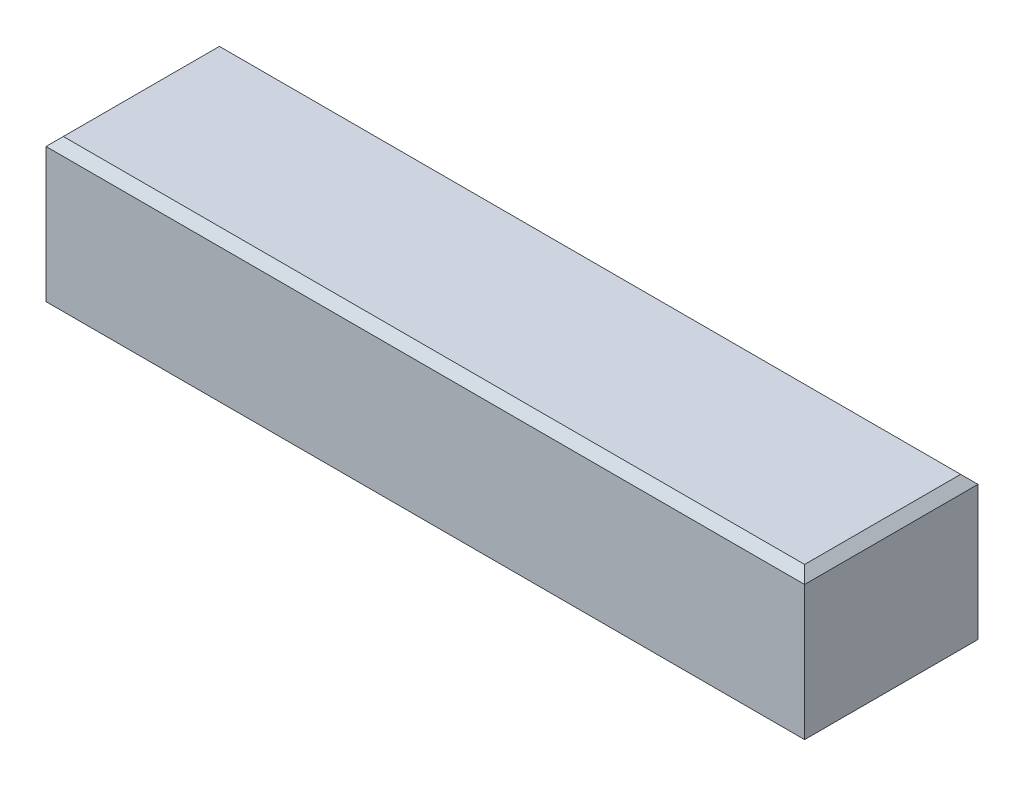
ISO-10303-21;
HEADER;
FILE_DESCRIPTION(('STEP AP214'),'2;1');
FILE_NAME('part.step','',(''),(''),'','','');
FILE_SCHEMA(('AUTOMOTIVE_DESIGN { 1 0 10303 214 1 1 1 1 }'));
ENDSEC;
DATA;
#1=APPLICATION_CONTEXT('core data for automotive mechanical design processes');
#2=APPLICATION_PROTOCOL_DEFINITION('international standard','automotive_design',2000,#1);
#3=PRODUCT_CONTEXT('',#1,'mechanical');
#4=PRODUCT('Part','Part','',(#3));
#5=PRODUCT_RELATED_PRODUCT_CATEGORY('part','',(#4));
#6=PRODUCT_DEFINITION_FORMATION('','',#4);
#7=PRODUCT_DEFINITION_CONTEXT('part definition',#1,'design');
#8=PRODUCT_DEFINITION('design','',#6,#7);
#9=PRODUCT_DEFINITION_SHAPE('','',#8);
#10=(LENGTH_UNIT() NAMED_UNIT(*) SI_UNIT(.MILLI.,.METRE.));
#11=(NAMED_UNIT(*) PLANE_ANGLE_UNIT() SI_UNIT($,.RADIAN.));
#12=(NAMED_UNIT(*) SI_UNIT($,.STERADIAN.) SOLID_ANGLE_UNIT());
#13=UNCERTAINTY_MEASURE_WITH_UNIT(LENGTH_MEASURE(1.E-05),#10,'distance_accuracy_value','');
#14=(GEOMETRIC_REPRESENTATION_CONTEXT(3) GLOBAL_UNCERTAINTY_ASSIGNED_CONTEXT((#13)) GLOBAL_UNIT_ASSIGNED_CONTEXT((#10,
#11,#12)) REPRESENTATION_CONTEXT('',''));
#15=CARTESIAN_POINT('',(0.,0.,0.));
#16=DIRECTION('',(0.,0.,1.));
#17=DIRECTION('',(1.,0.,0.));
#18=AXIS2_PLACEMENT_3D('',#15,#16,#17);
#19=CARTESIAN_POINT('',(0.,3.5,0.));
#20=DIRECTION('',(1.,0.,0.));
#21=DIRECTION('',(0.,0.,-1.));
#22=AXIS2_PLACEMENT_3D('',#19,#20,#21);
#23=PLANE('',#22);
#24=DIRECTION('',(0.,0.,-1.));
#25=VECTOR('',#24,1.);
#26=CARTESIAN_POINT('',(0.,6.6,2.));
#27=LINE('',#26,#25);
#28=CARTESIAN_POINT('',(0.,6.6,4.));
#29=VERTEX_POINT('',#28);
#30=CARTESIAN_POINT('',(0.,6.6,-4.));
#31=VERTEX_POINT('',#30);
#32=EDGE_CURVE('E96',#29,#31,#27,.T.);
#33=ORIENTED_EDGE('',*,*,#32,.T.);
#34=DIRECTION('',(0.,1.,0.));
#35=VECTOR('',#34,1.);
#36=CARTESIAN_POINT('',(0.,0.4,-4.));
#37=LINE('',#36,#35);
#38=CARTESIAN_POINT('',(0.,0.4,-4.));
#39=VERTEX_POINT('',#38);
#40=EDGE_CURVE('E11',#39,#31,#37,.T.);
#41=ORIENTED_EDGE('',*,*,#40,.F.);
#42=DIRECTION('',(0.,0.,1.));
#43=VECTOR('',#42,1.);
#44=CARTESIAN_POINT('',(0.,0.4,2.));
#45=LINE('',#44,#43);
#46=CARTESIAN_POINT('',(0.,0.4,4.));
#47=VERTEX_POINT('',#46);
#48=EDGE_CURVE('E120',#39,#47,#45,.T.);
#49=ORIENTED_EDGE('',*,*,#48,.T.);
#50=DIRECTION('',(0.,-1.,0.));
#51=VECTOR('',#50,1.);
#52=CARTESIAN_POINT('',(0.,6.6,4.));
#53=LINE('',#52,#51);
#54=EDGE_CURVE('E26',#29,#47,#53,.T.);
#55=ORIENTED_EDGE('',*,*,#54,.F.);
#56=EDGE_LOOP('',(#33,#41,#49,#55));
#57=FACE_BOUND('',#56,.T.);
#58=ADVANCED_FACE('F16',(#57),#23,.F.);
#59=CARTESIAN_POINT('',(0.,3.5,-4.));
#60=DIRECTION('',(0.,0.,-1.));
#61=DIRECTION('',(0.,1.,0.));
#62=AXIS2_PLACEMENT_3D('',#59,#60,#61);
#63=PLANE('',#62);
#64=DIRECTION('',(0.,-1.,0.));
#65=VECTOR('',#64,1.);
#66=CARTESIAN_POINT('',(35.,0.4,-4.));
#67=LINE('',#66,#65);
#68=CARTESIAN_POINT('',(35.,6.6,-4.));
#69=VERTEX_POINT('',#68);
#70=CARTESIAN_POINT('',(35.,0.4,-4.));
#71=VERTEX_POINT('',#70);
#72=EDGE_CURVE('E129',#69,#71,#67,.T.);
#73=ORIENTED_EDGE('',*,*,#72,.T.);
#74=DIRECTION('',(1.,0.,0.));
#75=VECTOR('',#74,1.);
#76=CARTESIAN_POINT('',(0.,0.4,-4.));
#77=LINE('',#76,#75);
#78=EDGE_CURVE('E78',#39,#71,#77,.T.);
#79=ORIENTED_EDGE('',*,*,#78,.F.);
#80=ORIENTED_EDGE('',*,*,#40,.T.);
#81=DIRECTION('',(1.,0.,0.));
#82=VECTOR('',#81,1.);
#83=CARTESIAN_POINT('',(0.,6.6,-4.));
#84=LINE('',#83,#82);
#85=EDGE_CURVE('E76',#31,#69,#84,.T.);
#86=ORIENTED_EDGE('',*,*,#85,.T.);
#87=EDGE_LOOP('',(#73,#79,#80,#86));
#88=FACE_BOUND('',#87,.T.);
#89=ADVANCED_FACE('F18',(#88),#63,.T.);
#90=CARTESIAN_POINT('',(0.,6.8,3.8));
#91=DIRECTION('',(0.,0.707106781186547,0.707106781186548));
#92=DIRECTION('',(0.,-0.707106781186548,0.707106781186547));
#93=AXIS2_PLACEMENT_3D('',#90,#91,#92);
#94=PLANE('',#93);
#95=DIRECTION('',(-0.577350269189626,-0.577350269189626,0.577350269189626));
#96=VECTOR('',#95,1.);
#97=CARTESIAN_POINT('',(0.133333333333333,6.73333333333333,3.86666666666666));
#98=LINE('',#97,#96);
#99=CARTESIAN_POINT('',(0.4,7.,3.6));
#100=VERTEX_POINT('',#99);
#101=EDGE_CURVE('E101',#100,#29,#98,.T.);
#102=ORIENTED_EDGE('',*,*,#101,.T.);
#103=DIRECTION('',(1.,0.,0.));
#104=VECTOR('',#103,1.);
#105=CARTESIAN_POINT('',(0.,6.6,4.));
#106=LINE('',#105,#104);
#107=CARTESIAN_POINT('',(35.,6.6,4.));
#108=VERTEX_POINT('',#107);
#109=EDGE_CURVE('E150',#29,#108,#106,.T.);
#110=ORIENTED_EDGE('',*,*,#109,.T.);
#111=DIRECTION('',(-0.577350269189623,0.577350269189627,-0.577350269189627));
#112=VECTOR('',#111,1.);
#113=CARTESIAN_POINT('',(29.0333333333334,12.5666666666667,-1.96666666666665));
#114=LINE('',#113,#112);
#115=CARTESIAN_POINT('',(34.6,7.,3.6));
#116=VERTEX_POINT('',#115);
#117=EDGE_CURVE('E109',#108,#116,#114,.T.);
#118=ORIENTED_EDGE('',*,*,#117,.T.);
#119=DIRECTION('',(1.,0.,0.));
#120=VECTOR('',#119,1.);
#121=CARTESIAN_POINT('',(0.,7.,3.6));
#122=LINE('',#121,#120);
#123=EDGE_CURVE('E90',#100,#116,#122,.T.);
#124=ORIENTED_EDGE('',*,*,#123,.F.);
#125=EDGE_LOOP('',(#102,#110,#118,#124));
#126=FACE_BOUND('',#125,.T.);
#127=ADVANCED_FACE('F181',(#126),#94,.T.);
#128=CARTESIAN_POINT('',(0.,3.5,4.));
#129=DIRECTION('',(0.,0.,1.));
#130=DIRECTION('',(0.,-1.,0.));
#131=AXIS2_PLACEMENT_3D('',#128,#129,#130);
#132=PLANE('',#131);
#133=DIRECTION('',(0.,1.,0.));
#134=VECTOR('',#133,1.);
#135=CARTESIAN_POINT('',(35.,6.6,4.));
#136=LINE('',#135,#134);
#137=CARTESIAN_POINT('',(35.,0.4,4.));
#138=VERTEX_POINT('',#137);
#139=EDGE_CURVE('E114',#138,#108,#136,.T.);
#140=ORIENTED_EDGE('',*,*,#139,.T.);
#141=ORIENTED_EDGE('',*,*,#109,.F.);
#142=ORIENTED_EDGE('',*,*,#54,.T.);
#143=DIRECTION('',(1.,0.,0.));
#144=VECTOR('',#143,1.);
#145=CARTESIAN_POINT('',(0.,0.4,4.));
#146=LINE('',#145,#144);
#147=EDGE_CURVE('E148',#47,#138,#146,.T.);
#148=ORIENTED_EDGE('',*,*,#147,.T.);
#149=EDGE_LOOP('',(#140,#141,#142,#148));
#150=FACE_BOUND('',#149,.T.);
#151=ADVANCED_FACE('F206',(#150),#132,.T.);
#152=CARTESIAN_POINT('',(0.,0.2,3.8));
#153=DIRECTION('',(0.,-0.707106781186548,0.707106781186548));
#154=DIRECTION('',(0.,-0.707106781186548,-0.707106781186548));
#155=AXIS2_PLACEMENT_3D('',#152,#153,#154);
#156=PLANE('',#155);
#157=DIRECTION('',(0.577350269189623,0.577350269189627,0.577350269189627));
#158=VECTOR('',#157,1.);
#159=CARTESIAN_POINT('',(29.0333333333334,-5.56666666666665,-1.96666666666665));
#160=LINE('',#159,#158);
#161=CARTESIAN_POINT('',(34.6,0.,3.6));
#162=VERTEX_POINT('',#161);
#163=EDGE_CURVE('E126',#162,#138,#160,.T.);
#164=ORIENTED_EDGE('',*,*,#163,.T.);
#165=ORIENTED_EDGE('',*,*,#147,.F.);
#166=DIRECTION('',(0.577350269189626,-0.577350269189626,-0.577350269189626));
#167=VECTOR('',#166,1.);
#168=CARTESIAN_POINT('',(0.133333333333333,0.266666666666666,3.86666666666666));
#169=LINE('',#168,#167);
#170=CARTESIAN_POINT('',(0.4,0.,3.6));
#171=VERTEX_POINT('',#170);
#172=EDGE_CURVE('E122',#47,#171,#169,.T.);
#173=ORIENTED_EDGE('',*,*,#172,.T.);
#174=DIRECTION('',(1.,0.,0.));
#175=VECTOR('',#174,1.);
#176=CARTESIAN_POINT('',(0.,0.,3.6));
#177=LINE('',#176,#175);
#178=EDGE_CURVE('E124',#171,#162,#177,.T.);
#179=ORIENTED_EDGE('',*,*,#178,.T.);
#180=EDGE_LOOP('',(#164,#165,#173,#179));
#181=FACE_BOUND('',#180,.T.);
#182=ADVANCED_FACE('F158',(#181),#156,.T.);
#183=CARTESIAN_POINT('',(0.2,0.2,4.));
#184=DIRECTION('',(0.707106781186548,0.707106781186548,0.));
#185=DIRECTION('',(0.707106781186548,-0.707106781186548,0.));
#186=AXIS2_PLACEMENT_3D('',#183,#184,#185);
#187=PLANE('',#186);
#188=ORIENTED_EDGE('',*,*,#48,.F.);
#189=DIRECTION('',(-0.577350269189626,0.577350269189626,-0.577350269189626));
#190=VECTOR('',#189,1.);
#191=CARTESIAN_POINT('',(1.46666666666667,-1.06666666666667,-2.53333333333333));
#192=LINE('',#191,#190);
#193=CARTESIAN_POINT('',(0.4,0.,-3.6));
#194=VERTEX_POINT('',#193);
#195=EDGE_CURVE('E131',#194,#39,#192,.T.);
#196=ORIENTED_EDGE('',*,*,#195,.F.);
#197=DIRECTION('',(0.,0.,-1.));
#198=VECTOR('',#197,1.);
#199=CARTESIAN_POINT('',(0.4,0.,2.));
#200=LINE('',#199,#198);
#201=EDGE_CURVE('E123',#171,#194,#200,.T.);
#202=ORIENTED_EDGE('',*,*,#201,.F.);
#203=ORIENTED_EDGE('',*,*,#172,.F.);
#204=EDGE_LOOP('',(#188,#196,#202,#203));
#205=FACE_BOUND('',#204,.T.);
#206=ADVANCED_FACE('F161',(#205),#187,.F.);
#207=CARTESIAN_POINT('',(0.,0.,0.));
#208=DIRECTION('',(0.,-1.,0.));
#209=DIRECTION('',(0.,0.,-1.));
#210=AXIS2_PLACEMENT_3D('',#207,#208,#209);
#211=PLANE('',#210);
#212=DIRECTION('',(0.,0.,1.));
#213=VECTOR('',#212,1.);
#214=CARTESIAN_POINT('',(34.6,0.,2.));
#215=LINE('',#214,#213);
#216=CARTESIAN_POINT('',(34.6,0.,-3.6));
#217=VERTEX_POINT('',#216);
#218=EDGE_CURVE('E128',#217,#162,#215,.T.);
#219=ORIENTED_EDGE('',*,*,#218,.T.);
#220=ORIENTED_EDGE('',*,*,#178,.F.);
#221=ORIENTED_EDGE('',*,*,#201,.T.);
#222=DIRECTION('',(1.,0.,0.));
#223=VECTOR('',#222,1.);
#224=CARTESIAN_POINT('',(0.,0.,-3.6));
#225=LINE('',#224,#223);
#226=EDGE_CURVE('E130',#194,#217,#225,.T.);
#227=ORIENTED_EDGE('',*,*,#226,.T.);
#228=EDGE_LOOP('',(#219,#220,#221,#227));
#229=FACE_BOUND('',#228,.T.);
#230=ADVANCED_FACE('F162',(#229),#211,.T.);
#231=CARTESIAN_POINT('',(0.,0.2,-3.8));
#232=DIRECTION('',(0.,-0.707106781186548,-0.707106781186547));
#233=DIRECTION('',(0.,0.707106781186547,-0.707106781186548));
#234=AXIS2_PLACEMENT_3D('',#231,#232,#233);
#235=PLANE('',#234);
#236=DIRECTION('',(-0.577350269189623,-0.577350269189627,0.577350269189627));
#237=VECTOR('',#236,1.);
#238=CARTESIAN_POINT('',(27.7,-6.9,3.3));
#239=LINE('',#238,#237);
#240=EDGE_CURVE('E20',#71,#217,#239,.T.);
#241=ORIENTED_EDGE('',*,*,#240,.T.);
#242=ORIENTED_EDGE('',*,*,#226,.F.);
#243=ORIENTED_EDGE('',*,*,#195,.T.);
#244=ORIENTED_EDGE('',*,*,#78,.T.);
#245=EDGE_LOOP('',(#241,#242,#243,#244));
#246=FACE_BOUND('',#245,.T.);
#247=ADVANCED_FACE('F164',(#246),#235,.T.);
#248=CARTESIAN_POINT('',(34.8,0.2,4.));
#249=DIRECTION('',(-0.70710678118655,0.707106781186545,0.));
#250=DIRECTION('',(0.707106781186545,0.70710678118655,0.));
#251=AXIS2_PLACEMENT_3D('',#248,#249,#250);
#252=PLANE('',#251);
#253=DIRECTION('',(0.,0.,-1.));
#254=VECTOR('',#253,1.);
#255=CARTESIAN_POINT('',(35.,0.400000000000005,2.));
#256=LINE('',#255,#254);
#257=EDGE_CURVE('E117',#138,#71,#256,.T.);
#258=ORIENTED_EDGE('',*,*,#257,.F.);
#259=ORIENTED_EDGE('',*,*,#163,.F.);
#260=ORIENTED_EDGE('',*,*,#218,.F.);
#261=ORIENTED_EDGE('',*,*,#240,.F.);
#262=EDGE_LOOP('',(#258,#259,#260,#261));
#263=FACE_BOUND('',#262,.T.);
#264=ADVANCED_FACE('F171',(#263),#252,.F.);
#265=CARTESIAN_POINT('',(35.,3.5,0.));
#266=DIRECTION('',(1.,0.,0.));
#267=DIRECTION('',(0.,0.,-1.));
#268=AXIS2_PLACEMENT_3D('',#265,#266,#267);
#269=PLANE('',#268);
#270=DIRECTION('',(0.,0.,1.));
#271=VECTOR('',#270,1.);
#272=CARTESIAN_POINT('',(35.,6.6,2.));
#273=LINE('',#272,#271);
#274=EDGE_CURVE('E111',#69,#108,#273,.T.);
#275=ORIENTED_EDGE('',*,*,#274,.T.);
#276=ORIENTED_EDGE('',*,*,#139,.F.);
#277=ORIENTED_EDGE('',*,*,#257,.T.);
#278=ORIENTED_EDGE('',*,*,#72,.F.);
#279=EDGE_LOOP('',(#275,#276,#277,#278));
#280=FACE_BOUND('',#279,.T.);
#281=ADVANCED_FACE('F191',(#280),#269,.T.);
#282=CARTESIAN_POINT('',(34.8,6.8,4.));
#283=DIRECTION('',(-0.70710678118655,-0.707106781186545,0.));
#284=DIRECTION('',(-0.707106781186545,0.70710678118655,0.));
#285=AXIS2_PLACEMENT_3D('',#282,#283,#284);
#286=PLANE('',#285);
#287=ORIENTED_EDGE('',*,*,#117,.F.);
#288=ORIENTED_EDGE('',*,*,#274,.F.);
#289=DIRECTION('',(0.577350269189623,-0.577350269189627,-0.577350269189627));
#290=VECTOR('',#289,1.);
#291=CARTESIAN_POINT('',(27.7,13.9,3.3));
#292=LINE('',#291,#290);
#293=CARTESIAN_POINT('',(34.6,7.,-3.6));
#294=VERTEX_POINT('',#293);
#295=EDGE_CURVE('E89',#294,#69,#292,.T.);
#296=ORIENTED_EDGE('',*,*,#295,.F.);
#297=DIRECTION('',(0.,0.,-1.));
#298=VECTOR('',#297,1.);
#299=CARTESIAN_POINT('',(34.6,7.,2.));
#300=LINE('',#299,#298);
#301=EDGE_CURVE('E112',#116,#294,#300,.T.);
#302=ORIENTED_EDGE('',*,*,#301,.F.);
#303=EDGE_LOOP('',(#287,#288,#296,#302));
#304=FACE_BOUND('',#303,.T.);
#305=ADVANCED_FACE('F185',(#304),#286,.F.);
#306=CARTESIAN_POINT('',(0.,7.,0.));
#307=DIRECTION('',(0.,1.,0.));
#308=DIRECTION('',(0.,0.,1.));
#309=AXIS2_PLACEMENT_3D('',#306,#307,#308);
#310=PLANE('',#309);
#311=DIRECTION('',(0.,0.,1.));
#312=VECTOR('',#311,1.);
#313=CARTESIAN_POINT('',(0.4,7.,2.));
#314=LINE('',#313,#312);
#315=CARTESIAN_POINT('',(0.4,7.,-3.6));
#316=VERTEX_POINT('',#315);
#317=EDGE_CURVE('E98',#316,#100,#314,.T.);
#318=ORIENTED_EDGE('',*,*,#317,.T.);
#319=ORIENTED_EDGE('',*,*,#123,.T.);
#320=ORIENTED_EDGE('',*,*,#301,.T.);
#321=DIRECTION('',(1.,0.,0.));
#322=VECTOR('',#321,1.);
#323=CARTESIAN_POINT('',(0.,7.,-3.6));
#324=LINE('',#323,#322);
#325=EDGE_CURVE('E99',#316,#294,#324,.T.);
#326=ORIENTED_EDGE('',*,*,#325,.F.);
#327=EDGE_LOOP('',(#318,#319,#320,#326));
#328=FACE_BOUND('',#327,.T.);
#329=ADVANCED_FACE('F183',(#328),#310,.T.);
#330=CARTESIAN_POINT('',(0.,6.8,-3.8));
#331=DIRECTION('',(0.,0.707106781186548,-0.707106781186548));
#332=DIRECTION('',(0.,0.707106781186548,0.707106781186548));
#333=AXIS2_PLACEMENT_3D('',#330,#331,#332);
#334=PLANE('',#333);
#335=DIRECTION('',(0.577350269189626,0.577350269189626,0.577350269189626));
#336=VECTOR('',#335,1.);
#337=CARTESIAN_POINT('',(1.46666666666667,8.06666666666667,-2.53333333333333));
#338=LINE('',#337,#336);
#339=EDGE_CURVE('E86',#31,#316,#338,.T.);
#340=ORIENTED_EDGE('',*,*,#339,.T.);
#341=ORIENTED_EDGE('',*,*,#325,.T.);
#342=ORIENTED_EDGE('',*,*,#295,.T.);
#343=ORIENTED_EDGE('',*,*,#85,.F.);
#344=EDGE_LOOP('',(#340,#341,#342,#343));
#345=FACE_BOUND('',#344,.T.);
#346=ADVANCED_FACE('F84',(#345),#334,.T.);
#347=CARTESIAN_POINT('',(0.2,6.8,4.));
#348=DIRECTION('',(0.707106781186548,-0.707106781186547,0.));
#349=DIRECTION('',(-0.707106781186547,-0.707106781186548,0.));
#350=AXIS2_PLACEMENT_3D('',#347,#348,#349);
#351=PLANE('',#350);
#352=ORIENTED_EDGE('',*,*,#32,.F.);
#353=ORIENTED_EDGE('',*,*,#101,.F.);
#354=ORIENTED_EDGE('',*,*,#317,.F.);
#355=ORIENTED_EDGE('',*,*,#339,.F.);
#356=EDGE_LOOP('',(#352,#353,#354,#355));
#357=FACE_BOUND('',#356,.T.);
#358=ADVANCED_FACE('F94',(#357),#351,.F.);
#359=CLOSED_SHELL('',(#58,#89,#127,#151,#182,#206,#230,#247,#264,#281,#305,#329,#346,#358));
#360=MANIFOLD_SOLID_BREP('B1',#359);
#361=ADVANCED_BREP_SHAPE_REPRESENTATION('',(#18,#360),#14);
#362=SHAPE_DEFINITION_REPRESENTATION(#9,#361);
ENDSEC;
END-ISO-10303-21;
